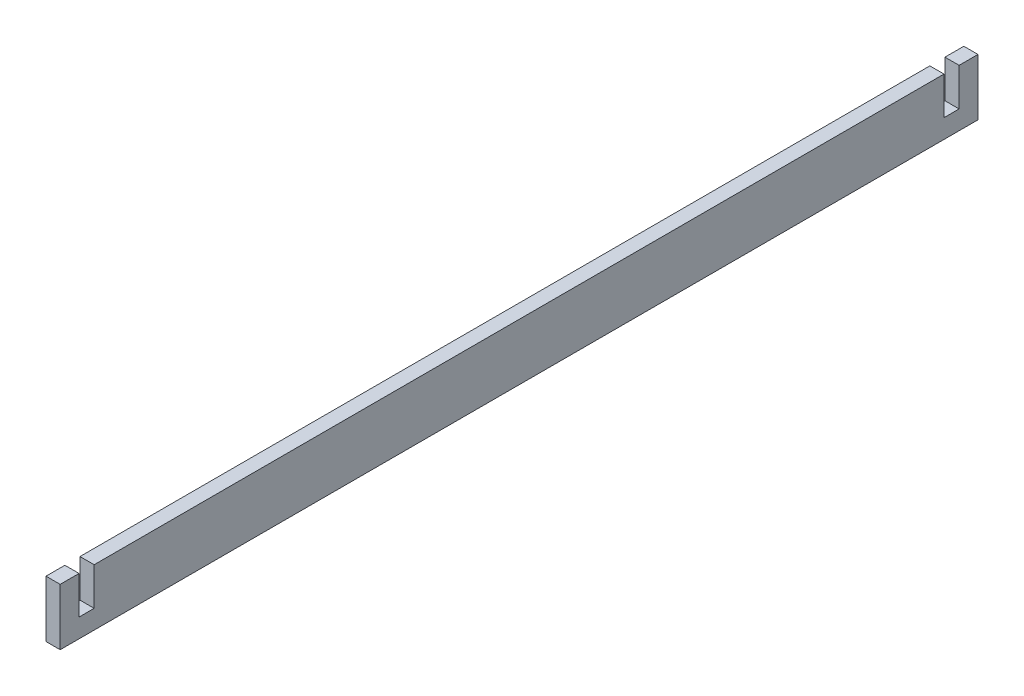
ISO-10303-21;
HEADER;
FILE_DESCRIPTION(('STEP AP214'),'2;1');
FILE_NAME('part.step','',(''),(''),'','','');
FILE_SCHEMA(('AUTOMOTIVE_DESIGN { 1 0 10303 214 1 1 1 1 }'));
ENDSEC;
DATA;
#1=APPLICATION_CONTEXT('core data for automotive mechanical design processes');
#2=APPLICATION_PROTOCOL_DEFINITION('international standard','automotive_design',2000,#1);
#3=PRODUCT_CONTEXT('',#1,'mechanical');
#4=PRODUCT('Part','Part','',(#3));
#5=PRODUCT_RELATED_PRODUCT_CATEGORY('part','',(#4));
#6=PRODUCT_DEFINITION_FORMATION('','',#4);
#7=PRODUCT_DEFINITION_CONTEXT('part definition',#1,'design');
#8=PRODUCT_DEFINITION('design','',#6,#7);
#9=PRODUCT_DEFINITION_SHAPE('','',#8);
#10=(LENGTH_UNIT() NAMED_UNIT(*) SI_UNIT(.MILLI.,.METRE.));
#11=(NAMED_UNIT(*) PLANE_ANGLE_UNIT() SI_UNIT($,.RADIAN.));
#12=(NAMED_UNIT(*) SI_UNIT($,.STERADIAN.) SOLID_ANGLE_UNIT());
#13=UNCERTAINTY_MEASURE_WITH_UNIT(LENGTH_MEASURE(1.E-05),#10,'distance_accuracy_value','');
#14=(GEOMETRIC_REPRESENTATION_CONTEXT(3) GLOBAL_UNCERTAINTY_ASSIGNED_CONTEXT((#13)) GLOBAL_UNIT_ASSIGNED_CONTEXT((#10,
#11,#12)) REPRESENTATION_CONTEXT('',''));
#15=CARTESIAN_POINT('',(0.,0.,0.));
#16=DIRECTION('',(0.,0.,1.));
#17=DIRECTION('',(1.,0.,0.));
#18=AXIS2_PLACEMENT_3D('',#15,#16,#17);
#19=CARTESIAN_POINT('',(3.,11.9999999999999,93.2));
#20=DIRECTION('',(0.,-1.,0.));
#21=DIRECTION('',(0.,0.,-1.));
#22=AXIS2_PLACEMENT_3D('',#19,#20,#21);
#23=PLANE('',#22);
#24=DIRECTION('',(0.,0.,1.));
#25=VECTOR('',#24,1.);
#26=CARTESIAN_POINT('',(0.,11.9999999999999,93.2));
#27=LINE('',#26,#25);
#28=CARTESIAN_POINT('',(0.,11.9999999999999,93.2));
#29=VERTEX_POINT('',#28);
#30=CARTESIAN_POINT('',(0.,12.,97.2));
#31=VERTEX_POINT('',#30);
#32=EDGE_CURVE('E155',#29,#31,#27,.T.);
#33=ORIENTED_EDGE('',*,*,#32,.T.);
#34=DIRECTION('',(-1.,0.,0.));
#35=VECTOR('',#34,1.);
#36=CARTESIAN_POINT('',(3.,12.,97.2));
#37=LINE('',#36,#35);
#38=CARTESIAN_POINT('',(3.,12.,97.2));
#39=VERTEX_POINT('',#38);
#40=EDGE_CURVE('E11',#39,#31,#37,.T.);
#41=ORIENTED_EDGE('',*,*,#40,.F.);
#42=DIRECTION('',(0.,0.,1.));
#43=VECTOR('',#42,1.);
#44=CARTESIAN_POINT('',(3.,11.9999999999999,93.2));
#45=LINE('',#44,#43);
#46=CARTESIAN_POINT('',(3.,11.9999999999999,93.2));
#47=VERTEX_POINT('',#46);
#48=EDGE_CURVE('E177',#47,#39,#45,.T.);
#49=ORIENTED_EDGE('',*,*,#48,.F.);
#50=DIRECTION('',(-1.,0.,0.));
#51=VECTOR('',#50,1.);
#52=CARTESIAN_POINT('',(3.,11.9999999999999,93.2));
#53=LINE('',#52,#51);
#54=EDGE_CURVE('E151',#47,#29,#53,.T.);
#55=ORIENTED_EDGE('',*,*,#54,.T.);
#56=EDGE_LOOP('',(#33,#41,#49,#55));
#57=FACE_BOUND('',#56,.T.);
#58=ADVANCED_FACE('F35',(#57),#23,.F.);
#59=CARTESIAN_POINT('',(3.,12.,97.2));
#60=DIRECTION('',(0.,0.,-1.));
#61=DIRECTION('',(-1.,0.,0.));
#62=AXIS2_PLACEMENT_3D('',#59,#60,#61);
#63=PLANE('',#62);
#64=DIRECTION('',(0.,-1.,0.));
#65=VECTOR('',#64,1.);
#66=CARTESIAN_POINT('',(0.,12.,97.2));
#67=LINE('',#66,#65);
#68=CARTESIAN_POINT('',(0.,0.,97.2));
#69=VERTEX_POINT('',#68);
#70=EDGE_CURVE('E158',#31,#69,#67,.T.);
#71=ORIENTED_EDGE('',*,*,#70,.T.);
#72=DIRECTION('',(-1.,0.,0.));
#73=VECTOR('',#72,1.);
#74=CARTESIAN_POINT('',(3.,0.,97.2));
#75=LINE('',#74,#73);
#76=CARTESIAN_POINT('',(3.,0.,97.2));
#77=VERTEX_POINT('',#76);
#78=EDGE_CURVE('E43',#77,#69,#75,.T.);
#79=ORIENTED_EDGE('',*,*,#78,.F.);
#80=DIRECTION('',(0.,-1.,0.));
#81=VECTOR('',#80,1.);
#82=CARTESIAN_POINT('',(3.,12.,97.2));
#83=LINE('',#82,#81);
#84=EDGE_CURVE('E106',#39,#77,#83,.T.);
#85=ORIENTED_EDGE('',*,*,#84,.F.);
#86=ORIENTED_EDGE('',*,*,#40,.T.);
#87=EDGE_LOOP('',(#71,#79,#85,#86));
#88=FACE_BOUND('',#87,.T.);
#89=ADVANCED_FACE('F255',(#88),#63,.F.);
#90=CARTESIAN_POINT('',(3.,0.,97.2));
#91=DIRECTION('',(0.,1.,0.));
#92=DIRECTION('',(0.,0.,1.));
#93=AXIS2_PLACEMENT_3D('',#90,#91,#92);
#94=PLANE('',#93);
#95=DIRECTION('',(0.,0.,-1.));
#96=VECTOR('',#95,1.);
#97=CARTESIAN_POINT('',(0.,0.,97.2));
#98=LINE('',#97,#96);
#99=CARTESIAN_POINT('',(0.,0.,-97.2));
#100=VERTEX_POINT('',#99);
#101=EDGE_CURVE('E160',#69,#100,#98,.T.);
#102=ORIENTED_EDGE('',*,*,#101,.T.);
#103=DIRECTION('',(-1.,0.,0.));
#104=VECTOR('',#103,1.);
#105=CARTESIAN_POINT('',(3.,0.,-97.2));
#106=LINE('',#105,#104);
#107=CARTESIAN_POINT('',(3.,0.,-97.2));
#108=VERTEX_POINT('',#107);
#109=EDGE_CURVE('E196',#108,#100,#106,.T.);
#110=ORIENTED_EDGE('',*,*,#109,.F.);
#111=DIRECTION('',(0.,0.,-1.));
#112=VECTOR('',#111,1.);
#113=CARTESIAN_POINT('',(3.,0.,97.2));
#114=LINE('',#113,#112);
#115=EDGE_CURVE('E204',#77,#108,#114,.T.);
#116=ORIENTED_EDGE('',*,*,#115,.F.);
#117=ORIENTED_EDGE('',*,*,#78,.T.);
#118=EDGE_LOOP('',(#102,#110,#116,#117));
#119=FACE_BOUND('',#118,.T.);
#120=ADVANCED_FACE('F202',(#119),#94,.F.);
#121=CARTESIAN_POINT('',(3.,0.,-97.2));
#122=DIRECTION('',(0.,0.,1.));
#123=DIRECTION('',(1.,0.,0.));
#124=AXIS2_PLACEMENT_3D('',#121,#122,#123);
#125=PLANE('',#124);
#126=DIRECTION('',(0.,1.,0.));
#127=VECTOR('',#126,1.);
#128=CARTESIAN_POINT('',(0.,0.,-97.2));
#129=LINE('',#128,#127);
#130=CARTESIAN_POINT('',(0.,12.,-97.2));
#131=VERTEX_POINT('',#130);
#132=EDGE_CURVE('E162',#100,#131,#129,.T.);
#133=ORIENTED_EDGE('',*,*,#132,.T.);
#134=DIRECTION('',(-1.,0.,0.));
#135=VECTOR('',#134,1.);
#136=CARTESIAN_POINT('',(3.,12.,-97.2));
#137=LINE('',#136,#135);
#138=CARTESIAN_POINT('',(3.,12.,-97.2));
#139=VERTEX_POINT('',#138);
#140=EDGE_CURVE('E193',#139,#131,#137,.T.);
#141=ORIENTED_EDGE('',*,*,#140,.F.);
#142=DIRECTION('',(0.,1.,0.));
#143=VECTOR('',#142,1.);
#144=CARTESIAN_POINT('',(3.,0.,-97.2));
#145=LINE('',#144,#143);
#146=EDGE_CURVE('E222',#108,#139,#145,.T.);
#147=ORIENTED_EDGE('',*,*,#146,.F.);
#148=ORIENTED_EDGE('',*,*,#109,.T.);
#149=EDGE_LOOP('',(#133,#141,#147,#148));
#150=FACE_BOUND('',#149,.T.);
#151=ADVANCED_FACE('F213',(#150),#125,.F.);
#152=CARTESIAN_POINT('',(3.,12.,-97.2));
#153=DIRECTION('',(0.,-1.,0.));
#154=DIRECTION('',(0.,0.,-1.));
#155=AXIS2_PLACEMENT_3D('',#152,#153,#154);
#156=PLANE('',#155);
#157=DIRECTION('',(0.,0.,1.));
#158=VECTOR('',#157,1.);
#159=CARTESIAN_POINT('',(0.,12.,-97.2));
#160=LINE('',#159,#158);
#161=CARTESIAN_POINT('',(0.,11.9999999999999,-93.2));
#162=VERTEX_POINT('',#161);
#163=EDGE_CURVE('E164',#131,#162,#160,.T.);
#164=ORIENTED_EDGE('',*,*,#163,.T.);
#165=DIRECTION('',(-1.,0.,0.));
#166=VECTOR('',#165,1.);
#167=CARTESIAN_POINT('',(3.,11.9999999999999,-93.2));
#168=LINE('',#167,#166);
#169=CARTESIAN_POINT('',(3.,11.9999999999999,-93.2));
#170=VERTEX_POINT('',#169);
#171=EDGE_CURVE('E190',#170,#162,#168,.T.);
#172=ORIENTED_EDGE('',*,*,#171,.F.);
#173=DIRECTION('',(0.,0.,1.));
#174=VECTOR('',#173,1.);
#175=CARTESIAN_POINT('',(3.,12.,-97.2));
#176=LINE('',#175,#174);
#177=EDGE_CURVE('E219',#139,#170,#176,.T.);
#178=ORIENTED_EDGE('',*,*,#177,.F.);
#179=ORIENTED_EDGE('',*,*,#140,.T.);
#180=EDGE_LOOP('',(#164,#172,#178,#179));
#181=FACE_BOUND('',#180,.T.);
#182=ADVANCED_FACE('F217',(#181),#156,.F.);
#183=CARTESIAN_POINT('',(3.,11.9999999999999,-93.2));
#184=DIRECTION('',(0.,0.,-1.));
#185=DIRECTION('',(-1.,0.,0.));
#186=AXIS2_PLACEMENT_3D('',#183,#184,#185);
#187=PLANE('',#186);
#188=DIRECTION('',(0.,-1.,0.));
#189=VECTOR('',#188,1.);
#190=CARTESIAN_POINT('',(0.,11.9999999999999,-93.2));
#191=LINE('',#190,#189);
#192=CARTESIAN_POINT('',(0.,4.,-93.2));
#193=VERTEX_POINT('',#192);
#194=EDGE_CURVE('E166',#162,#193,#191,.T.);
#195=ORIENTED_EDGE('',*,*,#194,.T.);
#196=DIRECTION('',(-1.,0.,0.));
#197=VECTOR('',#196,1.);
#198=CARTESIAN_POINT('',(3.,4.,-93.2));
#199=LINE('',#198,#197);
#200=CARTESIAN_POINT('',(3.,4.,-93.2));
#201=VERTEX_POINT('',#200);
#202=EDGE_CURVE('E187',#201,#193,#199,.T.);
#203=ORIENTED_EDGE('',*,*,#202,.F.);
#204=DIRECTION('',(0.,-1.,0.));
#205=VECTOR('',#204,1.);
#206=CARTESIAN_POINT('',(3.,11.9999999999999,-93.2));
#207=LINE('',#206,#205);
#208=EDGE_CURVE('E221',#170,#201,#207,.T.);
#209=ORIENTED_EDGE('',*,*,#208,.F.);
#210=ORIENTED_EDGE('',*,*,#171,.T.);
#211=EDGE_LOOP('',(#195,#203,#209,#210));
#212=FACE_BOUND('',#211,.T.);
#213=ADVANCED_FACE('F268',(#212),#187,.F.);
#214=CARTESIAN_POINT('',(3.,4.,-93.2));
#215=DIRECTION('',(0.,-1.,0.));
#216=DIRECTION('',(0.,0.,-1.));
#217=AXIS2_PLACEMENT_3D('',#214,#215,#216);
#218=PLANE('',#217);
#219=DIRECTION('',(0.,0.,1.));
#220=VECTOR('',#219,1.);
#221=CARTESIAN_POINT('',(0.,4.,-93.2));
#222=LINE('',#221,#220);
#223=CARTESIAN_POINT('',(0.,4.,-90.));
#224=VERTEX_POINT('',#223);
#225=EDGE_CURVE('E168',#193,#224,#222,.T.);
#226=ORIENTED_EDGE('',*,*,#225,.T.);
#227=DIRECTION('',(-1.,0.,0.));
#228=VECTOR('',#227,1.);
#229=CARTESIAN_POINT('',(3.,4.,-90.));
#230=LINE('',#229,#228);
#231=CARTESIAN_POINT('',(3.,4.,-90.));
#232=VERTEX_POINT('',#231);
#233=EDGE_CURVE('E184',#232,#224,#230,.T.);
#234=ORIENTED_EDGE('',*,*,#233,.F.);
#235=DIRECTION('',(0.,0.,1.));
#236=VECTOR('',#235,1.);
#237=CARTESIAN_POINT('',(3.,4.,-93.2));
#238=LINE('',#237,#236);
#239=EDGE_CURVE('E224',#201,#232,#238,.T.);
#240=ORIENTED_EDGE('',*,*,#239,.F.);
#241=ORIENTED_EDGE('',*,*,#202,.T.);
#242=EDGE_LOOP('',(#226,#234,#240,#241));
#243=FACE_BOUND('',#242,.T.);
#244=ADVANCED_FACE('F271',(#243),#218,.F.);
#245=CARTESIAN_POINT('',(3.,4.,-90.));
#246=DIRECTION('',(0.,0.,1.));
#247=DIRECTION('',(1.,0.,0.));
#248=AXIS2_PLACEMENT_3D('',#245,#246,#247);
#249=PLANE('',#248);
#250=DIRECTION('',(0.,1.,0.));
#251=VECTOR('',#250,1.);
#252=CARTESIAN_POINT('',(0.,4.,-90.));
#253=LINE('',#252,#251);
#254=CARTESIAN_POINT('',(0.,12.,-90.));
#255=VERTEX_POINT('',#254);
#256=EDGE_CURVE('E170',#224,#255,#253,.T.);
#257=ORIENTED_EDGE('',*,*,#256,.T.);
#258=DIRECTION('',(-1.,0.,0.));
#259=VECTOR('',#258,1.);
#260=CARTESIAN_POINT('',(3.,12.,-90.));
#261=LINE('',#260,#259);
#262=CARTESIAN_POINT('',(3.,12.,-90.));
#263=VERTEX_POINT('',#262);
#264=EDGE_CURVE('E181',#263,#255,#261,.T.);
#265=ORIENTED_EDGE('',*,*,#264,.F.);
#266=DIRECTION('',(0.,1.,0.));
#267=VECTOR('',#266,1.);
#268=CARTESIAN_POINT('',(3.,4.,-90.));
#269=LINE('',#268,#267);
#270=EDGE_CURVE('E230',#232,#263,#269,.T.);
#271=ORIENTED_EDGE('',*,*,#270,.F.);
#272=ORIENTED_EDGE('',*,*,#233,.T.);
#273=EDGE_LOOP('',(#257,#265,#271,#272));
#274=FACE_BOUND('',#273,.T.);
#275=ADVANCED_FACE('F236',(#274),#249,.F.);
#276=CARTESIAN_POINT('',(3.,12.,-90.));
#277=DIRECTION('',(0.,-1.,0.));
#278=DIRECTION('',(0.,0.,-1.));
#279=AXIS2_PLACEMENT_3D('',#276,#277,#278);
#280=PLANE('',#279);
#281=DIRECTION('',(0.,0.,1.));
#282=VECTOR('',#281,1.);
#283=CARTESIAN_POINT('',(0.,12.,-90.));
#284=LINE('',#283,#282);
#285=CARTESIAN_POINT('',(0.,12.,90.));
#286=VERTEX_POINT('',#285);
#287=EDGE_CURVE('E172',#255,#286,#284,.T.);
#288=ORIENTED_EDGE('',*,*,#287,.T.);
#289=DIRECTION('',(-1.,0.,0.));
#290=VECTOR('',#289,1.);
#291=CARTESIAN_POINT('',(3.,12.,90.));
#292=LINE('',#291,#290);
#293=CARTESIAN_POINT('',(3.,12.,90.));
#294=VERTEX_POINT('',#293);
#295=EDGE_CURVE('E146',#294,#286,#292,.T.);
#296=ORIENTED_EDGE('',*,*,#295,.F.);
#297=DIRECTION('',(0.,0.,1.));
#298=VECTOR('',#297,1.);
#299=CARTESIAN_POINT('',(3.,12.,-90.));
#300=LINE('',#299,#298);
#301=EDGE_CURVE('E137',#263,#294,#300,.T.);
#302=ORIENTED_EDGE('',*,*,#301,.F.);
#303=ORIENTED_EDGE('',*,*,#264,.T.);
#304=EDGE_LOOP('',(#288,#296,#302,#303));
#305=FACE_BOUND('',#304,.T.);
#306=ADVANCED_FACE('F240',(#305),#280,.F.);
#307=CARTESIAN_POINT('',(3.,12.,90.));
#308=DIRECTION('',(0.,0.,-1.));
#309=DIRECTION('',(-1.,0.,0.));
#310=AXIS2_PLACEMENT_3D('',#307,#308,#309);
#311=PLANE('',#310);
#312=DIRECTION('',(0.,-1.,0.));
#313=VECTOR('',#312,1.);
#314=CARTESIAN_POINT('',(0.,12.,90.));
#315=LINE('',#314,#313);
#316=CARTESIAN_POINT('',(0.,4.,90.));
#317=VERTEX_POINT('',#316);
#318=EDGE_CURVE('E145',#286,#317,#315,.T.);
#319=ORIENTED_EDGE('',*,*,#318,.T.);
#320=DIRECTION('',(-1.,0.,0.));
#321=VECTOR('',#320,1.);
#322=CARTESIAN_POINT('',(3.,4.,90.));
#323=LINE('',#322,#321);
#324=CARTESIAN_POINT('',(3.,4.,90.));
#325=VERTEX_POINT('',#324);
#326=EDGE_CURVE('E142',#325,#317,#323,.T.);
#327=ORIENTED_EDGE('',*,*,#326,.F.);
#328=DIRECTION('',(0.,-1.,0.));
#329=VECTOR('',#328,1.);
#330=CARTESIAN_POINT('',(3.,12.,90.));
#331=LINE('',#330,#329);
#332=EDGE_CURVE('E131',#294,#325,#331,.T.);
#333=ORIENTED_EDGE('',*,*,#332,.F.);
#334=ORIENTED_EDGE('',*,*,#295,.T.);
#335=EDGE_LOOP('',(#319,#327,#333,#334));
#336=FACE_BOUND('',#335,.T.);
#337=ADVANCED_FACE('F143',(#336),#311,.F.);
#338=CARTESIAN_POINT('',(3.,4.,90.));
#339=DIRECTION('',(0.,-1.,0.));
#340=DIRECTION('',(0.,0.,-1.));
#341=AXIS2_PLACEMENT_3D('',#338,#339,#340);
#342=PLANE('',#341);
#343=DIRECTION('',(0.,0.,1.));
#344=VECTOR('',#343,1.);
#345=CARTESIAN_POINT('',(0.,4.,90.));
#346=LINE('',#345,#344);
#347=CARTESIAN_POINT('',(0.,4.,93.2));
#348=VERTEX_POINT('',#347);
#349=EDGE_CURVE('E92',#317,#348,#346,.T.);
#350=ORIENTED_EDGE('',*,*,#349,.T.);
#351=DIRECTION('',(-1.,0.,0.));
#352=VECTOR('',#351,1.);
#353=CARTESIAN_POINT('',(3.,4.,93.2));
#354=LINE('',#353,#352);
#355=CARTESIAN_POINT('',(3.,4.,93.2));
#356=VERTEX_POINT('',#355);
#357=EDGE_CURVE('E147',#356,#348,#354,.T.);
#358=ORIENTED_EDGE('',*,*,#357,.F.);
#359=DIRECTION('',(0.,0.,1.));
#360=VECTOR('',#359,1.);
#361=CARTESIAN_POINT('',(3.,4.,90.));
#362=LINE('',#361,#360);
#363=EDGE_CURVE('E135',#325,#356,#362,.T.);
#364=ORIENTED_EDGE('',*,*,#363,.F.);
#365=ORIENTED_EDGE('',*,*,#326,.T.);
#366=EDGE_LOOP('',(#350,#358,#364,#365));
#367=FACE_BOUND('',#366,.T.);
#368=ADVANCED_FACE('F149',(#367),#342,.F.);
#369=CARTESIAN_POINT('',(3.,4.,93.2));
#370=DIRECTION('',(0.,0.,1.));
#371=DIRECTION('',(1.,0.,0.));
#372=AXIS2_PLACEMENT_3D('',#369,#370,#371);
#373=PLANE('',#372);
#374=DIRECTION('',(0.,1.,0.));
#375=VECTOR('',#374,1.);
#376=CARTESIAN_POINT('',(0.,4.,93.2));
#377=LINE('',#376,#375);
#378=EDGE_CURVE('E98',#348,#29,#377,.T.);
#379=ORIENTED_EDGE('',*,*,#378,.T.);
#380=ORIENTED_EDGE('',*,*,#54,.F.);
#381=DIRECTION('',(0.,1.,0.));
#382=VECTOR('',#381,1.);
#383=CARTESIAN_POINT('',(3.,4.,93.2));
#384=LINE('',#383,#382);
#385=EDGE_CURVE('E51',#356,#47,#384,.T.);
#386=ORIENTED_EDGE('',*,*,#385,.F.);
#387=ORIENTED_EDGE('',*,*,#357,.T.);
#388=EDGE_LOOP('',(#379,#380,#386,#387));
#389=FACE_BOUND('',#388,.T.);
#390=ADVANCED_FACE('F244',(#389),#373,.F.);
#391=CARTESIAN_POINT('',(3.,0.,0.));
#392=DIRECTION('',(1.,0.,0.));
#393=DIRECTION('',(0.,0.,-1.));
#394=AXIS2_PLACEMENT_3D('',#391,#392,#393);
#395=PLANE('',#394);
#396=ORIENTED_EDGE('',*,*,#48,.T.);
#397=ORIENTED_EDGE('',*,*,#84,.T.);
#398=ORIENTED_EDGE('',*,*,#115,.T.);
#399=ORIENTED_EDGE('',*,*,#146,.T.);
#400=ORIENTED_EDGE('',*,*,#177,.T.);
#401=ORIENTED_EDGE('',*,*,#208,.T.);
#402=ORIENTED_EDGE('',*,*,#239,.T.);
#403=ORIENTED_EDGE('',*,*,#270,.T.);
#404=ORIENTED_EDGE('',*,*,#301,.T.);
#405=ORIENTED_EDGE('',*,*,#332,.T.);
#406=ORIENTED_EDGE('',*,*,#363,.T.);
#407=ORIENTED_EDGE('',*,*,#385,.T.);
#408=EDGE_LOOP('',(#396,#397,#398,#399,#400,#401,#402,#403,#404,#405,#406,#407));
#409=FACE_BOUND('',#408,.T.);
#410=ADVANCED_FACE('F133',(#409),#395,.T.);
#411=CARTESIAN_POINT('',(0.,0.,0.));
#412=DIRECTION('',(1.,0.,0.));
#413=DIRECTION('',(0.,0.,-1.));
#414=AXIS2_PLACEMENT_3D('',#411,#412,#413);
#415=PLANE('',#414);
#416=ORIENTED_EDGE('',*,*,#32,.F.);
#417=ORIENTED_EDGE('',*,*,#378,.F.);
#418=ORIENTED_EDGE('',*,*,#349,.F.);
#419=ORIENTED_EDGE('',*,*,#318,.F.);
#420=ORIENTED_EDGE('',*,*,#287,.F.);
#421=ORIENTED_EDGE('',*,*,#256,.F.);
#422=ORIENTED_EDGE('',*,*,#225,.F.);
#423=ORIENTED_EDGE('',*,*,#194,.F.);
#424=ORIENTED_EDGE('',*,*,#163,.F.);
#425=ORIENTED_EDGE('',*,*,#132,.F.);
#426=ORIENTED_EDGE('',*,*,#101,.F.);
#427=ORIENTED_EDGE('',*,*,#70,.F.);
#428=EDGE_LOOP('',(#416,#417,#418,#419,#420,#421,#422,#423,#424,#425,#426,#427));
#429=FACE_BOUND('',#428,.T.);
#430=ADVANCED_FACE('F208',(#429),#415,.F.);
#431=CLOSED_SHELL('',(#58,#89,#120,#151,#182,#213,#244,#275,#306,#337,#368,#390,#410,#430));
#432=MANIFOLD_SOLID_BREP('B2',#431);
#433=ADVANCED_BREP_SHAPE_REPRESENTATION('',(#18,#432),#14);
#434=SHAPE_DEFINITION_REPRESENTATION(#9,#433);
ENDSEC;
END-ISO-10303-21;
